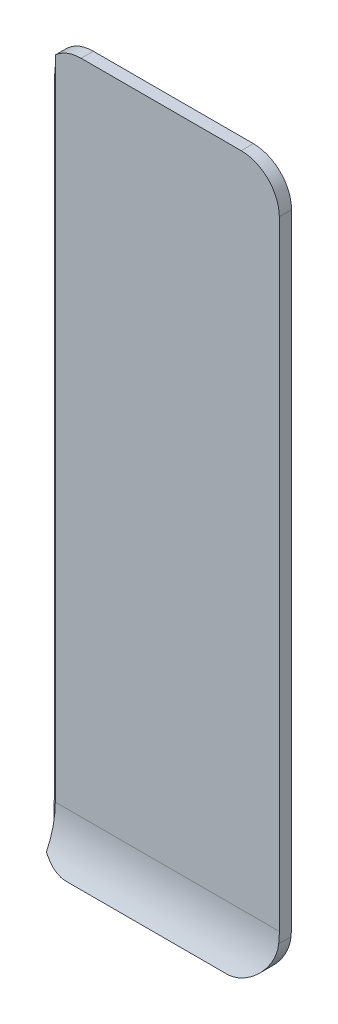
ISO-10303-21;
HEADER;
FILE_DESCRIPTION(('STEP AP214'),'2;1');
FILE_NAME('part.step','',(''),(''),'','','');
FILE_SCHEMA(('AUTOMOTIVE_DESIGN { 1 0 10303 214 1 1 1 1 }'));
ENDSEC;
DATA;
#1=APPLICATION_CONTEXT('core data for automotive mechanical design processes');
#2=APPLICATION_PROTOCOL_DEFINITION('international standard','automotive_design',2000,#1);
#3=PRODUCT_CONTEXT('',#1,'mechanical');
#4=PRODUCT('Part','Part','',(#3));
#5=PRODUCT_RELATED_PRODUCT_CATEGORY('part','',(#4));
#6=PRODUCT_DEFINITION_FORMATION('','',#4);
#7=PRODUCT_DEFINITION_CONTEXT('part definition',#1,'design');
#8=PRODUCT_DEFINITION('design','',#6,#7);
#9=PRODUCT_DEFINITION_SHAPE('','',#8);
#10=(LENGTH_UNIT() NAMED_UNIT(*) SI_UNIT(.MILLI.,.METRE.));
#11=(NAMED_UNIT(*) PLANE_ANGLE_UNIT() SI_UNIT($,.RADIAN.));
#12=(NAMED_UNIT(*) SI_UNIT($,.STERADIAN.) SOLID_ANGLE_UNIT());
#13=UNCERTAINTY_MEASURE_WITH_UNIT(LENGTH_MEASURE(1.E-05),#10,'distance_accuracy_value','');
#14=(GEOMETRIC_REPRESENTATION_CONTEXT(3) GLOBAL_UNCERTAINTY_ASSIGNED_CONTEXT((#13)) GLOBAL_UNIT_ASSIGNED_CONTEXT((#10,
#11,#12)) REPRESENTATION_CONTEXT('',''));
#15=CARTESIAN_POINT('',(0.,0.,0.));
#16=DIRECTION('',(0.,0.,1.));
#17=DIRECTION('',(1.,0.,0.));
#18=AXIS2_PLACEMENT_3D('',#15,#16,#17);
#19=CARTESIAN_POINT('',(619.,0.,32.));
#20=DIRECTION('',(0.,0.,-1.));
#21=DIRECTION('',(0.,1.,0.));
#22=AXIS2_PLACEMENT_3D('',#19,#20,#21);
#23=PLANE('',#22);
#24=DIRECTION('',(0.,1.,0.));
#25=VECTOR('',#24,1.);
#26=CARTESIAN_POINT('',(32.5,1848.,31.9999999999998));
#27=LINE('',#26,#25);
#28=CARTESIAN_POINT('',(32.5,127.446930131722,32.));
#29=VERTEX_POINT('',#28);
#30=CARTESIAN_POINT('',(32.5,1821.78177281687,31.9999999999998));
#31=VERTEX_POINT('',#30);
#32=EDGE_CURVE('E290',#29,#31,#27,.T.);
#33=ORIENTED_EDGE('',*,*,#32,.F.);
#34=DIRECTION('',(-1.,0.,0.));
#35=VECTOR('',#34,1.);
#36=CARTESIAN_POINT('',(619.,127.446930131722,32.));
#37=LINE('',#36,#35);
#38=CARTESIAN_POINT('',(619.,127.446930131722,32.));
#39=VERTEX_POINT('',#38);
#40=EDGE_CURVE('E471',#39,#29,#37,.T.);
#41=ORIENTED_EDGE('',*,*,#40,.F.);
#42=DIRECTION('',(0.,-1.,0.));
#43=VECTOR('',#42,1.);
#44=CARTESIAN_POINT('',(619.,0.,32.));
#45=LINE('',#44,#43);
#46=CARTESIAN_POINT('',(619.,1748.,31.9999999999999));
#47=VERTEX_POINT('',#46);
#48=EDGE_CURVE('E457',#47,#39,#45,.T.);
#49=ORIENTED_EDGE('',*,*,#48,.F.);
#50=CARTESIAN_POINT('',(519.,1748.,31.9999999999999));
#51=DIRECTION('',(0.,0.,-1.));
#52=DIRECTION('',(0.,1.,0.));
#53=AXIS2_PLACEMENT_3D('',#50,#51,#52);
#54=CIRCLE('',#53,100.);
#55=CARTESIAN_POINT('',(519.,1848.,31.9999999999999));
#56=VERTEX_POINT('',#55);
#57=EDGE_CURVE('E412',#56,#47,#54,.T.);
#58=ORIENTED_EDGE('',*,*,#57,.F.);
#59=DIRECTION('',(-1.,0.,0.));
#60=VECTOR('',#59,1.);
#61=CARTESIAN_POINT('',(619.,1848.,31.9999999999999));
#62=LINE('',#61,#60);
#63=CARTESIAN_POINT('',(100.,1848.,31.9999999999999));
#64=VERTEX_POINT('',#63);
#65=EDGE_CURVE('E451',#56,#64,#62,.T.);
#66=ORIENTED_EDGE('',*,*,#65,.T.);
#67=CARTESIAN_POINT('',(100.,1748.,31.9999999999999));
#68=DIRECTION('',(0.,0.,-1.));
#69=DIRECTION('',(0.,1.,0.));
#70=AXIS2_PLACEMENT_3D('',#67,#68,#69);
#71=CIRCLE('',#70,100.);
#72=EDGE_CURVE('E506',#31,#64,#71,.T.);
#73=ORIENTED_EDGE('',*,*,#72,.F.);
#74=EDGE_LOOP('',(#33,#41,#49,#58,#66,#73));
#75=FACE_BOUND('',#74,.T.);
#76=ADVANCED_FACE('F174',(#75),#23,.F.);
#77=CARTESIAN_POINT('',(619.,127.446930131722,264.72));
#78=DIRECTION('',(-1.,0.,0.));
#79=DIRECTION('',(0.,0.,1.));
#80=AXIS2_PLACEMENT_3D('',#77,#78,#79);
#81=CYLINDRICAL_SURFACE('',#80,232.72);
#82=CARTESIAN_POINT('',(32.5,127.446930131722,264.72));
#83=DIRECTION('',(-1.,0.,0.));
#84=DIRECTION('',(0.,0.,1.));
#85=AXIS2_PLACEMENT_3D('',#82,#83,#84);
#86=CIRCLE('',#85,232.72);
#87=CARTESIAN_POINT('',(32.5,26.2182271831315,55.1696525907292));
#88=VERTEX_POINT('',#87);
#89=EDGE_CURVE('E12',#88,#29,#86,.F.);
#90=ORIENTED_EDGE('',*,*,#89,.F.);
#91=CARTESIAN_POINT('',(100.000000000001,0.,69.9999999999999));
#92=CARTESIAN_POINT('',(98.7198197089697,-3.4698594050321E-05,70.0000509763334));
#93=CARTESIAN_POINT('',(97.439652230179,0.0245815621368389,69.9839119463368));
#94=CARTESIAN_POINT('',(94.8820639765618,0.122862892112704,69.9196234798617));
#95=CARTESIAN_POINT('',(93.6046430770499,0.196525685541535,69.8714755286344));
#96=CARTESIAN_POINT('',(91.0560089387093,0.392580922295405,69.7435818762787));
#97=CARTESIAN_POINT('',(89.7847920962634,0.514940488855972,69.663857493593));
#98=CARTESIAN_POINT('',(87.2502546411074,0.807907020868423,69.4735226187817));
#99=CARTESIAN_POINT('',(85.9869340771845,0.97851428411858,69.3629119360171));
#100=CARTESIAN_POINT('',(83.4789277123208,1.36606212977329,69.1125719878279));
#101=CARTESIAN_POINT('',(82.234173996887,1.58269057330033,68.97303903554));
#102=CARTESIAN_POINT('',(79.7570212815522,2.0621955038391,68.6655488047547));
#103=CARTESIAN_POINT('',(78.5246236025374,2.32507688082448,68.4975885209217));
#104=CARTESIAN_POINT('',(76.074412554528,2.89619614383816,68.1345796051548));
#105=CARTESIAN_POINT('',(74.8565993379382,3.20443450339168,67.9395306904178));
#106=CARTESIAN_POINT('',(72.4373945492545,3.86532701733694,67.5238079673618));
#107=CARTESIAN_POINT('',(71.2360046526703,4.21798566655604,67.3031315660097));
#108=CARTESIAN_POINT('',(68.8546814121097,4.96567825225909,66.838382459443));
#109=CARTESIAN_POINT('',(67.6746996687698,5.36059748728867,66.5943732654884));
#110=CARTESIAN_POINT('',(65.3344950636642,6.19250811085542,66.0841483638062));
#111=CARTESIAN_POINT('',(64.1742740752037,6.6295034623384,65.8179305646736));
#112=CARTESIAN_POINT('',(60.72575628049,8.00188554873549,64.9886228409477));
#113=CARTESIAN_POINT('',(58.4689648828789,8.9988698221595,64.3947522095117));
#114=CARTESIAN_POINT('',(54.0470655543328,11.1496495249836,63.1385191593972));
#115=CARTESIAN_POINT('',(51.8821089644468,12.3036915444161,62.4760494351777));
#116=CARTESIAN_POINT('',(47.6552250226393,14.7591732371291,61.0976781329845));
#117=CARTESIAN_POINT('',(45.5933030784267,16.0606206352031,60.3817737554335));
#118=CARTESIAN_POINT('',(41.3921917066704,18.9309764748862,58.8419306549945));
#119=CARTESIAN_POINT('',(39.2637185222361,20.5135081855694,58.0141422464184));
#120=CARTESIAN_POINT('',(35.1459557573445,23.8360177211081,56.3289089931109));
#121=CARTESIAN_POINT('',(33.1566728357727,25.5760030694524,55.4714627324711));
#122=CARTESIAN_POINT('',(29.3240399896439,29.2053836026813,53.7431316644415));
#123=CARTESIAN_POINT('',(27.4807543952578,31.094843925197,52.8722411328966));
#124=CARTESIAN_POINT('',(23.948448661222,35.0144607467335,51.1329399230475));
#125=CARTESIAN_POINT('',(22.2594353776961,37.0446234917642,50.2645293566172));
#126=CARTESIAN_POINT('',(19.7568534961458,40.3074423155143,48.9263459475948));
#127=CARTESIAN_POINT('',(18.8870011920031,41.4948617847292,48.4504437592022));
#128=CARTESIAN_POINT('',(17.1992060334361,43.9090277300756,47.5065191842756));
#129=CARTESIAN_POINT('',(16.3812589823096,45.1357710146512,47.0384961629402));
#130=CARTESIAN_POINT('',(14.798618902337,47.6272653527657,46.1126207069017));
#131=CARTESIAN_POINT('',(14.033937437254,48.8920245746398,45.65477049528));
#132=CARTESIAN_POINT('',(12.5596700212016,51.4574710323985,44.7517080590417));
#133=CARTESIAN_POINT('',(11.850078076529,52.7581543388315,44.3064944629228));
#134=CARTESIAN_POINT('',(10.4882856258948,55.3922784831771,43.4313886017683));
#135=CARTESIAN_POINT('',(9.83602228664765,56.7256813556928,43.0014798778126));
#136=CARTESIAN_POINT('',(8.58972147210493,59.4245156005648,42.1586651972311));
#137=CARTESIAN_POINT('',(7.9956778023838,60.7899435463341,41.7457574344627));
#138=CARTESIAN_POINT('',(6.86746081426198,63.5506713309373,40.9390034030173));
#139=CARTESIAN_POINT('',(6.33328144065563,64.9459681315357,40.5451552087805));
#140=CARTESIAN_POINT('',(5.32639155335511,67.7642018545995,39.7784462593437));
#141=CARTESIAN_POINT('',(4.85367832604773,69.1871375536703,39.4055845780417));
#142=CARTESIAN_POINT('',(4.05212363157295,71.7952122791721,38.7488797266629));
#143=CARTESIAN_POINT('',(3.71278767954092,72.9761828736718,38.4612383896953));
#144=CARTESIAN_POINT('',(3.07704789291639,75.3533965562662,37.9021150587025));
#145=CARTESIAN_POINT('',(2.78064299612713,76.5496392657022,37.6306326649719));
#146=CARTESIAN_POINT('',(2.23161209205389,78.955649426998,37.1047319493603));
#147=CARTESIAN_POINT('',(1.97897953688364,80.1654148271325,36.8503110787496));
#148=CARTESIAN_POINT('',(1.51821644357809,82.5968621963487,36.3593030746753));
#149=CARTESIAN_POINT('',(1.31008163413474,83.8185430098964,36.1227142309405));
#150=CARTESIAN_POINT('',(0.938446067432608,86.2756847006434,35.6674021994801));
#151=CARTESIAN_POINT('',(0.775074747537756,87.5111750080425,35.4487320769209));
#152=CARTESIAN_POINT('',(0.494378633905274,89.9906063805052,35.0306381001949));
#153=CARTESIAN_POINT('',(0.37705338117638,91.234547361206,34.8312140541965));
#154=CARTESIAN_POINT('',(0.188940541106296,93.7295881735627,34.4520439555517));
#155=CARTESIAN_POINT('',(0.118176662724469,94.980691325642,34.2723079667895));
#156=CARTESIAN_POINT('',(0.0236958887934082,97.4874501473326,33.9330194058127));
#157=CARTESIAN_POINT('',(-1.91688966658773E-05,98.7431059928657,33.7734676222778));
#158=CARTESIAN_POINT('',(0.,100.000000000001,33.6242094144846));
#159=B_SPLINE_CURVE_WITH_KNOTS('',3,(#91,#92,#93,#94,#95,#96,#97,#98,#99,#100,#101,#102,#103,
#104,#105,#106,#107,#108,#109,#110,#111,#112,#113,#114,#115,#116,#117,#118,#119,#120,#121,#122,
#123,#124,#125,#126,#127,#128,#129,#130,#131,#132,#133,#134,#135,#136,#137,#138,#139,#140,#141,
#142,#143,#144,#145,#146,#147,#148,#149,#150,#151,#152,#153,#154,#155,#156,#157,#158),
.UNSPECIFIED.,.F.,.F.,(4,2,2,2,2,2,2,2,2,2,2,2,2,2,2,2,2,2,2,2,2,2,2,2,2,2,2,2,2,2,2,2,2,4),(0.,
3.84018226888647,7.6801863612674,11.5176023288582,15.35504198257,19.1672408451736,
22.9798429852402,26.7924849315566,30.6055129842071,34.4084425109883,38.2117305683219,
45.8162649687765,53.4328797281392,61.0498938218015,69.3769927848348,77.7044898456937,
86.0356360355546,94.3671522957593,99.0068529929909,103.646178076669,108.286507221856,
112.926330792724,117.561003903649,122.195183360514,126.828893651503,131.462399303507,
135.247441126802,139.032389284889,142.816770764422,146.600788820514,150.395635899403,
154.19044514996,157.98718521755,161.784073593556),.UNSPECIFIED.);
#160=CARTESIAN_POINT('',(100.000000000001,0.,70.));
#161=VERTEX_POINT('',#160);
#162=EDGE_CURVE('E357',#161,#88,#159,.T.);
#163=ORIENTED_EDGE('',*,*,#162,.F.);
#164=DIRECTION('',(1.,0.,0.));
#165=VECTOR('',#164,1.);
#166=CARTESIAN_POINT('',(100.000000000001,0.,70.));
#167=LINE('',#166,#165);
#168=CARTESIAN_POINT('',(519.,0.,70.));
#169=VERTEX_POINT('',#168);
#170=EDGE_CURVE('E443',#161,#169,#167,.T.);
#171=ORIENTED_EDGE('',*,*,#170,.T.);
#172=CARTESIAN_POINT('',(619.,100.,33.6242094144847));
#173=CARTESIAN_POINT('',(619.000028069173,98.6148268452014,33.7886931118485));
#174=CARTESIAN_POINT('',(618.971220707669,97.231163329206,33.9656887510996));
#175=CARTESIAN_POINT('',(618.8565129221,94.4696275187115,34.3441457009941));
#176=CARTESIAN_POINT('',(618.770615354344,93.0917549379536,34.5456057872323));
#177=CARTESIAN_POINT('',(618.542364225347,90.3451483742039,34.97233896559));
#178=CARTESIAN_POINT('',(618.400040055311,88.9764100102376,35.1975996158567));
#179=CARTESIAN_POINT('',(618.059690027828,86.2499036405943,35.6712765475865));
#180=CARTESIAN_POINT('',(617.861663638572,84.8921357397834,35.9196930501113));
#181=CARTESIAN_POINT('',(617.411831801021,82.1963459511547,36.4375910943036));
#182=CARTESIAN_POINT('',(617.160281654681,80.8582614818452,36.7069689139042));
#183=CARTESIAN_POINT('',(616.603796862741,78.1975623480794,37.2668255641178));
#184=CARTESIAN_POINT('',(616.298856842909,76.8749492552858,37.5573065172513));
#185=CARTESIAN_POINT('',(615.636657976302,74.2474884892093,38.1582336300966));
#186=CARTESIAN_POINT('',(615.279399263899,72.9426407703086,38.4686797385303));
#187=CARTESIAN_POINT('',(614.513642598499,70.3526055206684,39.1083510335595));
#188=CARTESIAN_POINT('',(614.105139688317,69.0674199054849,39.4375780352705));
#189=CARTESIAN_POINT('',(613.238912314544,66.5211682285832,40.1128292315282));
#190=CARTESIAN_POINT('',(612.78128484972,65.2600602225843,40.4588196105764));
#191=CARTESIAN_POINT('',(611.817346002917,62.7611167526597,41.1668038499529));
#192=CARTESIAN_POINT('',(611.311030157414,61.5232834349087,41.5287991758934));
#193=CARTESIAN_POINT('',(609.720945416411,57.8474752721019,42.6365511942702));
#194=CARTESIAN_POINT('',(608.565801890937,55.4464962410211,43.4042595602058));
#195=CARTESIAN_POINT('',(606.073872990014,50.7535822601559,44.9863635200146));
#196=CARTESIAN_POINT('',(604.736883539379,48.4617737845558,45.800810964212));
#197=CARTESIAN_POINT('',(601.891299964008,43.999694849553,47.4624911832328));
#198=CARTESIAN_POINT('',(600.38269748795,41.8294303126025,48.3097255522641));
#199=CARTESIAN_POINT('',(597.089142062223,37.4694186587178,50.0840914720831));
#200=CARTESIAN_POINT('',(595.292153225262,35.2893218601619,51.0126117012639));
#201=CARTESIAN_POINT('',(591.521081077024,31.0894923326465,52.8730780102913));
#202=CARTESIAN_POINT('',(589.546988900552,29.069767640922,53.805024259391));
#203=CARTESIAN_POINT('',(585.429589459293,25.1996007563113,55.653777509807));
#204=CARTESIAN_POINT('',(583.286151467102,23.3492917710001,56.5705721414392));
#205=CARTESIAN_POINT('',(578.840181573988,19.8302585237088,58.3679869027091));
#206=CARTESIAN_POINT('',(576.537649488562,18.161534472321,59.248606990393));
#207=CARTESIAN_POINT('',(572.920975807188,15.7697188405483,60.5444131747391));
#208=CARTESIAN_POINT('',(571.660591684961,14.975954033178,60.980832993313));
#209=CARTESIAN_POINT('',(569.10089624166,13.4429380346039,61.8346689979427));
#210=CARTESIAN_POINT('',(567.801589186962,12.7036808992912,62.2520872542303));
#211=CARTESIAN_POINT('',(565.16534970905,11.2813182712557,63.0647984981835));
#212=CARTESIAN_POINT('',(563.828406868271,10.5982285349236,63.4600852675457));
#213=CARTESIAN_POINT('',(561.119308319156,9.2904313896761,64.2250772834076));
#214=CARTESIAN_POINT('',(559.747157263428,8.66571631693909,64.5947858863235));
#215=CARTESIAN_POINT('',(556.973196093844,7.47807361012916,65.3044808747895));
#216=CARTESIAN_POINT('',(555.571470671496,6.91499225893107,65.6445407531157));
#217=CARTESIAN_POINT('',(552.737632730134,5.85084958898624,66.2927343528613));
#218=CARTESIAN_POINT('',(551.305524505789,5.34977957234291,66.6008725507217));
#219=CARTESIAN_POINT('',(548.41403259162,4.41169574852989,67.1820695666731));
#220=CARTESIAN_POINT('',(546.954658937313,3.97465887687485,67.4551410112698));
#221=CARTESIAN_POINT('',(544.011498212164,3.16636104484741,67.9633827940326));
#222=CARTESIAN_POINT('',(542.527714176558,2.79509197332543,68.1985578056461));
#223=CARTESIAN_POINT('',(539.241131701148,2.05270791220762,68.6712346342868));
#224=CARTESIAN_POINT('',(537.433689556171,1.69637020546398,68.8998591730929));
#225=CARTESIAN_POINT('',(533.795661684785,1.08342236918336,69.2948335406402));
#226=CARTESIAN_POINT('',(531.965083263968,0.826781533123199,69.4612025434352));
#227=CARTESIAN_POINT('',(529.205102891259,0.517757594852006,69.6620649390539));
#228=CARTESIAN_POINT('',(528.281535040055,0.427337211756786,69.7209490778037));
#229=CARTESIAN_POINT('',(526.431305831884,0.272183737157343,69.8221011259015));
#230=CARTESIAN_POINT('',(525.504644497502,0.207450458528697,69.8643691562938));
#231=CARTESIAN_POINT('',(523.648846269931,0.103792612519486,69.9320955147734));
#232=CARTESIAN_POINT('',(522.719708435101,0.0648799143396051,69.9575461122031));
#233=CARTESIAN_POINT('',(520.860382748077,0.0129787845894659,69.9915054092897));
#234=CARTESIAN_POINT('',(519.930194876607,-9.16304065959842E-06,70.0000137926844));
#235=CARTESIAN_POINT('',(519.,0.,69.9999999999998));
#236=B_SPLINE_CURVE_WITH_KNOTS('',3,(#172,#173,#174,#175,#176,#177,#178,#179,#180,#181,#182,
#183,#184,#185,#186,#187,#188,#189,#190,#191,#192,#193,#194,#195,#196,#197,#198,#199,#200,#201,
#202,#203,#204,#205,#206,#207,#208,#209,#210,#211,#212,#213,#214,#215,#216,#217,#218,#219,#220,
#221,#222,#223,#224,#225,#226,#227,#228,#229,#230,#231,#232,#233,#234,#235),.UNSPECIFIED.,.F.,
.F.,(4,2,2,2,2,2,2,2,2,2,2,2,2,2,2,2,2,2,2,2,2,2,2,2,2,2,2,2,2,2,2,4),(0.,4.18432548507172,
8.36844163778998,12.5503812463004,16.7323607825808,20.8948228778441,25.05770420828,
29.2205748472601,33.3838484987202,37.5390477336482,41.694628261657,50.0035206682099,
58.3218158096169,66.640515923246,75.5525250395435,84.4649805100347,93.3843845132072,
102.303798860504,106.958877372936,111.6134474919,116.269318913395,120.924578219168,
125.567949027794,130.210667803307,134.851710156904,139.492179731164,145.057481888114,
150.621068576691,153.410197726269,156.199306557333,158.989696598995,161.780138728684),.UNSPECIFIED.);
#237=CARTESIAN_POINT('',(619.,100.,33.6242094144847));
#238=VERTEX_POINT('',#237);
#239=EDGE_CURVE('E349',#238,#169,#236,.T.);
#240=ORIENTED_EDGE('',*,*,#239,.F.);
#241=CARTESIAN_POINT('',(619.,127.446930131722,264.72));
#242=DIRECTION('',(-1.,0.,0.));
#243=DIRECTION('',(0.,0.,1.));
#244=AXIS2_PLACEMENT_3D('',#241,#242,#243);
#245=CIRCLE('',#244,232.72);
#246=EDGE_CURVE('E467',#39,#238,#245,.T.);
#247=ORIENTED_EDGE('',*,*,#246,.F.);
#248=ORIENTED_EDGE('',*,*,#40,.T.);
#249=EDGE_LOOP('',(#90,#163,#171,#240,#247,#248));
#250=FACE_BOUND('',#249,.T.);
#251=ADVANCED_FACE('F328',(#250),#81,.F.);
#252=CARTESIAN_POINT('',(100.,100.,70.));
#253=DIRECTION('',(0.,0.,-1.));
#254=DIRECTION('',(-1.,0.,0.));
#255=AXIS2_PLACEMENT_3D('',#252,#253,#254);
#256=CYLINDRICAL_SURFACE('',#255,100.);
#257=DIRECTION('',(0.,0.,-1.));
#258=VECTOR('',#257,1.);
#259=CARTESIAN_POINT('',(32.5,26.2182271831315,70.));
#260=LINE('',#259,#258);
#261=CARTESIAN_POINT('',(32.5,26.2182271831315,21.2020579518913));
#262=VERTEX_POINT('',#261);
#263=EDGE_CURVE('E190',#262,#88,#260,.F.);
#264=ORIENTED_EDGE('',*,*,#263,.F.);
#265=CARTESIAN_POINT('',(32.5,26.2182271831315,21.2020579518913));
#266=CARTESIAN_POINT('',(31.4441358656986,27.18419602599,20.8005032260007));
#267=CARTESIAN_POINT('',(30.4095321637802,28.1723484894706,20.3964838998934));
#268=CARTESIAN_POINT('',(28.3841842608256,30.1915491960904,19.5857268995023));
#269=CARTESIAN_POINT('',(27.3934399097633,31.2225972924766,19.1789892345225));
#270=CARTESIAN_POINT('',(25.4569718857776,33.3263093498009,18.3649320749907));
#271=CARTESIAN_POINT('',(24.5112561588606,34.3989805956263,17.9576124907162));
#272=CARTESIAN_POINT('',(22.666443375434,36.5841814320721,17.1446399374011));
#273=CARTESIAN_POINT('',(21.7673463881928,37.6967110819119,16.7389869708376));
#274=CARTESIAN_POINT('',(19.1347040518729,41.1013056790594,15.5243134445428));
#275=CARTESIAN_POINT('',(17.4735239475986,43.451996199642,14.7208461659425));
#276=CARTESIAN_POINT('',(14.3558816300483,48.2952847954872,13.1454830004974));
#277=CARTESIAN_POINT('',(12.8994024793954,50.787871105994,12.3735845053384));
#278=CARTESIAN_POINT('',(10.875551168294,54.6245571308502,11.250229427963));
#279=CARTESIAN_POINT('',(10.2270934885182,55.921298973964,10.8811225775983));
#280=CARTESIAN_POINT('',(8.9858609774918,58.5448237187626,10.1564736898989));
#281=CARTESIAN_POINT('',(8.39308073626832,59.871603686173,9.8009303366465));
#282=CARTESIAN_POINT('',(7.2644816883681,62.5534924530916,9.10505499666509));
#283=CARTESIAN_POINT('',(6.7286774921421,63.908608412747,8.76472692451757));
#284=CARTESIAN_POINT('',(5.71565548910165,66.6444926701922,8.10105483341023));
#285=CARTESIAN_POINT('',(5.23843123572221,68.025258126035,7.77770894785121));
#286=CARTESIAN_POINT('',(4.34529427288967,70.8057756377539,7.15050894653765));
#287=CARTESIAN_POINT('',(3.92919134547852,72.2054533185404,6.84659609487885));
#288=CARTESIAN_POINT('',(3.15782493767318,75.025420163174,6.25859500949616));
#289=CARTESIAN_POINT('',(2.80255456303034,76.4457069715396,5.97450453143664));
#290=CARTESIAN_POINT('',(2.15413705404113,79.3037805406417,5.42751717721052));
#291=CARTESIAN_POINT('',(1.86096391439357,80.7415597080524,5.16461145790812));
#292=CARTESIAN_POINT('',(1.33768132849109,83.6322313179982,4.66104052486067));
#293=CARTESIAN_POINT('',(1.10756292101442,85.0851215824775,4.42037215401044));
#294=CARTESIAN_POINT('',(0.758571350732282,87.6551190008965,4.01688290124046));
#295=CARTESIAN_POINT('',(0.626255810846091,88.7696572951606,3.84918613064133));
#296=CARTESIAN_POINT('',(0.399108319094969,91.0042634880851,3.52764882839623));
#297=CARTESIAN_POINT('',(0.304266811918665,92.1243299033107,3.37380477225268));
#298=CARTESIAN_POINT('',(0.152359116938101,94.3685658745172,3.08028561090914));
#299=CARTESIAN_POINT('',(0.0952828561738235,95.4927342558948,2.94060673591505));
#300=CARTESIAN_POINT('',(0.0190926496329532,97.7443432269705,2.67557294075223));
#301=CARTESIAN_POINT('',(-1.12325118692454E-05,98.8717846048316,2.55022182609272));
#302=CARTESIAN_POINT('',(0.,100.000000000001,2.43217255399681));
#303=B_SPLINE_CURVE_WITH_KNOTS('',3,(#265,#266,#267,#268,#269,#270,#271,#272,#273,#274,#275,
#276,#277,#278,#279,#280,#281,#282,#283,#284,#285,#286,#287,#288,#289,#290,#291,#292,#293,#294,
#295,#296,#297,#298,#299,#300,#301,#302),.UNSPECIFIED.,.F.,.F.,(4,2,2,2,2,2,2,2,2,2,2,2,2,2,2,2,
2,2,4),(0.,4.4586504437248,8.91728563492921,13.3767047280608,17.8361304470237,26.7904252760036,
35.7439787715266,40.2310721093001,44.7177290006276,49.205533651497,53.6928439879455,
58.165879046351,62.6384068326643,67.1090578783212,71.5790732334074,74.9828715176189,
78.3858013238051,81.787823115037,85.1907464071318),.UNSPECIFIED.);
#304=CARTESIAN_POINT('',(0.,100.000000000001,2.4321725539968));
#305=VERTEX_POINT('',#304);
#306=EDGE_CURVE('E294',#262,#305,#303,.T.);
#307=ORIENTED_EDGE('',*,*,#306,.T.);
#308=DIRECTION('',(0.,0.,-1.));
#309=VECTOR('',#308,1.);
#310=CARTESIAN_POINT('',(0.,100.000000000001,70.));
#311=LINE('',#310,#309);
#312=CARTESIAN_POINT('',(0.,100.000000000001,1.42673304023816));
#313=VERTEX_POINT('',#312);
#314=EDGE_CURVE('E446',#305,#313,#311,.T.);
#315=ORIENTED_EDGE('',*,*,#314,.T.);
#316=CARTESIAN_POINT('',(0.,100.000000000001,1.4267330402381));
#317=CARTESIAN_POINT('',(-2.61733614519786E-05,98.6090658352118,1.57170266653152));
#318=CARTESIAN_POINT('',(0.0290193063493295,97.2193049481032,1.72774660343505));
#319=CARTESIAN_POINT('',(0.144772062194768,94.4448481185563,2.06149697351221));
#320=CARTESIAN_POINT('',(0.231477034124557,93.0601519759425,2.23920254080593));
#321=CARTESIAN_POINT('',(0.462018673777076,90.2990142901069,2.6157222290139));
#322=CARTESIAN_POINT('',(0.605831211051162,88.9225695093634,2.81452740845328));
#323=CARTESIAN_POINT('',(0.949938708195479,86.1798894944613,3.23265081709496));
#324=CARTESIAN_POINT('',(1.1502340801018,84.8136543348555,3.451969195931));
#325=CARTESIAN_POINT('',(1.6056537271976,82.0991844994704,3.90944141689456));
#326=CARTESIAN_POINT('',(1.86056055950092,80.750900328973,4.14751825949453));
#327=CARTESIAN_POINT('',(2.42483046026472,78.0691065708112,4.64238013686886));
#328=CARTESIAN_POINT('',(2.73419892585647,76.7355984613844,4.89916702432339));
#329=CARTESIAN_POINT('',(3.40642147143633,74.085738073611,5.43041754850044));
#330=CARTESIAN_POINT('',(3.76927427655688,72.7693853871567,5.70488076379733));
#331=CARTESIAN_POINT('',(4.54749054125825,70.1557747084463,6.27041147078673));
#332=CARTESIAN_POINT('',(4.9628590434173,68.8585185632201,6.5614805555067));
#333=CARTESIAN_POINT('',(5.84435410055971,66.2871106843349,7.15856174229595));
#334=CARTESIAN_POINT('',(6.31040476593871,65.0129276503379,7.46455113435126));
#335=CARTESIAN_POINT('',(7.292694052929,62.4874500740877,8.090623047046));
#336=CARTESIAN_POINT('',(7.80893729227102,61.2361576503835,8.41070686289144));
#337=CARTESIAN_POINT('',(8.89038877554648,58.7584491809751,9.0635667221979));
#338=CARTESIAN_POINT('',(9.45559148658583,57.5320303435971,9.39634132910377));
#339=CARTESIAN_POINT('',(10.6338549395927,55.1055480274984,10.0732047597591));
#340=CARTESIAN_POINT('',(11.246919954073,53.9054869139264,10.4172945919915));
#341=CARTESIAN_POINT('',(13.1572679246877,50.345227545985,11.4649408887327));
#342=CARTESIAN_POINT('',(14.5249553970063,48.0266653678738,12.1834202349758));
#343=CARTESIAN_POINT('',(17.4380141450824,43.5134047265377,13.6473534419583));
#344=CARTESIAN_POINT('',(18.9833923726407,41.3187111144378,14.3928083572813));
#345=CARTESIAN_POINT('',(22.3336494060536,36.9449307624702,15.9394926758054));
#346=CARTESIAN_POINT('',(24.1481828941488,34.7735075346263,16.7415175021665));
#347=CARTESIAN_POINT('',(27.9548346630749,30.5918662194891,18.3446958211292));
#348=CARTESIAN_POINT('',(29.9469602966826,28.5816548133363,19.1458492762623));
#349=CARTESIAN_POINT('',(34.0992079928796,24.7331187802375,20.7304823219355));
#350=CARTESIAN_POINT('',(36.2594094192223,22.8948762686799,21.5139533349734));
#351=CARTESIAN_POINT('',(40.7365855729214,19.4028258657199,23.0450435840938));
#352=CARTESIAN_POINT('',(43.0535586990074,17.7490160909734,23.7926631862303));
#353=CARTESIAN_POINT('',(46.6700068269602,15.3946848698928,24.8830776778981));
#354=CARTESIAN_POINT('',(47.9167122522702,14.6214959048085,25.2460289995452));
#355=CARTESIAN_POINT('',(50.4464876081571,13.1287991388564,25.9549989589583));
#356=CARTESIAN_POINT('',(51.7295536558253,12.4092856356336,26.301019394074));
#357=CARTESIAN_POINT('',(54.3304849093389,11.0254753000557,26.9736742904581));
#358=CARTESIAN_POINT('',(55.6483583457805,10.3611916842734,27.3003041062127));
#359=CARTESIAN_POINT('',(58.3163946583011,9.0898225129533,27.9315350232183));
#360=CARTESIAN_POINT('',(59.6665536090266,8.48273004786154,28.2361387845129));
#361=CARTESIAN_POINT('',(62.3945627655218,7.32842548416509,28.8203582230395));
#362=CARTESIAN_POINT('',(63.7723586260211,6.7811073437237,29.1000179847293));
#363=CARTESIAN_POINT('',(66.5553263667407,5.74684534902598,29.6325564870152));
#364=CARTESIAN_POINT('',(67.9604947790191,5.25989390349141,29.8854385943905));
#365=CARTESIAN_POINT('',(70.7952385312421,4.34803746468405,30.362141724786));
#366=CARTESIAN_POINT('',(72.2248066071837,3.92311435284338,30.5859712319879));
#367=CARTESIAN_POINT('',(75.1055734180862,3.13671064024979,31.0025517353405));
#368=CARTESIAN_POINT('',(76.5567698780617,2.77522341736973,31.195305975294));
#369=CARTESIAN_POINT('',(79.8100714915924,2.04213618560702,31.588005534302));
#370=CARTESIAN_POINT('',(81.6169178870826,1.68693575843543,31.7796152722664));
#371=CARTESIAN_POINT('',(85.2515810970268,1.07639513461538,32.1102695310668));
#372=CARTESIAN_POINT('',(87.0793918325787,0.821026707940952,32.2493289114756));
#373=CARTESIAN_POINT('',(90.7520134231981,0.411386875980119,32.4729244189923));
#374=CARTESIAN_POINT('',(92.5968419899613,0.257236700358154,32.5573951630797));
#375=CARTESIAN_POINT('',(95.369738410206,0.102958966810055,32.6420080918979));
#376=CARTESIAN_POINT('',(96.2952121278368,0.0643576216457979,32.6631969006325));
#377=CARTESIAN_POINT('',(98.1471024345609,0.0128769598666768,32.6914651753081));
#378=CARTESIAN_POINT('',(99.0735190363495,-2.00570400173947E-06,32.6985444486904));
#379=CARTESIAN_POINT('',(100.000000000001,0.,32.6985389236588));
#380=B_SPLINE_CURVE_WITH_KNOTS('',3,(#316,#317,#318,#319,#320,#321,#322,#323,#324,#325,#326,
#327,#328,#329,#330,#331,#332,#333,#334,#335,#336,#337,#338,#339,#340,#341,#342,#343,#344,#345,
#346,#347,#348,#349,#350,#351,#352,#353,#354,#355,#356,#357,#358,#359,#360,#361,#362,#363,#364,
#365,#366,#367,#368,#369,#370,#371,#372,#373,#374,#375,#376,#377,#378,#379),.UNSPECIFIED.,.F.,
.F.,(4,2,2,2,2,2,2,2,2,2,2,2,2,2,2,2,2,2,2,2,2,2,2,2,2,2,2,2,2,2,2,4),(0.,4.19503172022143,
8.38989580747705,12.582989263738,16.7761133089477,20.9528422585723,25.1299853540089,
29.3070288980002,33.4844738284247,37.6557475619808,41.8274054176626,45.9985924491517,
50.170152255684,58.519024053684,66.8682225960578,75.6819959972139,84.4961344811491,
93.3144604727466,102.132696407321,106.665170537548,111.197162460612,115.730235791456,
120.262760754394,124.78710956186,129.310888841612,133.833344063171,138.355326900527,
143.905797659899,149.454697745854,155.010231716318,157.789392064359,160.568590340517),.UNSPECIFIED.);
#381=CARTESIAN_POINT('',(100.000000000001,0.,32.6985389236588));
#382=VERTEX_POINT('',#381);
#383=EDGE_CURVE('E341',#313,#382,#380,.T.);
#384=ORIENTED_EDGE('',*,*,#383,.T.);
#385=DIRECTION('',(0.,0.,-1.));
#386=VECTOR('',#385,1.);
#387=CARTESIAN_POINT('',(100.000000000001,0.,70.));
#388=LINE('',#387,#386);
#389=EDGE_CURVE('E184',#161,#382,#388,.T.);
#390=ORIENTED_EDGE('',*,*,#389,.F.);
#391=ORIENTED_EDGE('',*,*,#162,.T.);
#392=EDGE_LOOP('',(#264,#307,#315,#384,#390,#391));
#393=FACE_BOUND('',#392,.T.);
#394=ADVANCED_FACE('F176',(#393),#256,.T.);
#395=CARTESIAN_POINT('',(100.000000000001,0.,70.));
#396=DIRECTION('',(0.,1.,0.));
#397=DIRECTION('',(0.,0.,1.));
#398=AXIS2_PLACEMENT_3D('',#395,#396,#397);
#399=PLANE('',#398);
#400=ORIENTED_EDGE('',*,*,#389,.T.);
#401=DIRECTION('',(-1.,0.,0.));
#402=VECTOR('',#401,1.);
#403=CARTESIAN_POINT('',(619.,0.,32.6985389236588));
#404=LINE('',#403,#402);
#405=CARTESIAN_POINT('',(519.,0.,32.6985389236588));
#406=VERTEX_POINT('',#405);
#407=EDGE_CURVE('E442',#406,#382,#404,.T.);
#408=ORIENTED_EDGE('',*,*,#407,.F.);
#409=DIRECTION('',(0.,0.,-1.));
#410=VECTOR('',#409,1.);
#411=CARTESIAN_POINT('',(519.,0.,70.));
#412=LINE('',#411,#410);
#413=EDGE_CURVE('E434',#169,#406,#412,.T.);
#414=ORIENTED_EDGE('',*,*,#413,.F.);
#415=ORIENTED_EDGE('',*,*,#170,.F.);
#416=EDGE_LOOP('',(#400,#408,#414,#415));
#417=FACE_BOUND('',#416,.T.);
#418=ADVANCED_FACE('F368',(#417),#399,.F.);
#419=CARTESIAN_POINT('',(519.,100.,70.));
#420=DIRECTION('',(0.,0.,-1.));
#421=DIRECTION('',(-1.,0.,0.));
#422=AXIS2_PLACEMENT_3D('',#419,#420,#421);
#423=CYLINDRICAL_SURFACE('',#422,100.);
#424=ORIENTED_EDGE('',*,*,#413,.T.);
#425=CARTESIAN_POINT('',(519.,0.,32.6985389236588));
#426=CARTESIAN_POINT('',(520.309908376861,-3.10420277061312E-05,32.698579730086));
#427=CARTESIAN_POINT('',(521.619807154216,0.0257366885771971,32.6844028198184));
#428=CARTESIAN_POINT('',(524.236934982897,0.128643887065852,32.6279088350687));
#429=CARTESIAN_POINT('',(525.54416412225,0.205781632761689,32.5855927039585));
#430=CARTESIAN_POINT('',(528.152739080183,0.41115180987073,32.4731435833718));
#431=CARTESIAN_POINT('',(529.454087509885,0.539358716388517,32.4030244901837));
#432=CARTESIAN_POINT('',(532.049030454088,0.846433720378712,32.2355414039735));
#433=CARTESIAN_POINT('',(533.342624937783,1.02530201899941,32.1381773027767));
#434=CARTESIAN_POINT('',(535.912835220642,1.43205383378148,31.9175461650667));
#435=CARTESIAN_POINT('',(537.18950451466,1.6596749180598,31.7944178935238));
#436=CARTESIAN_POINT('',(539.730570020104,2.1638030457206,31.522876446358));
#437=CARTESIAN_POINT('',(540.994964966337,2.4403150733248,31.3744606928411));
#438=CARTESIAN_POINT('',(543.509139287192,3.0413868476081,31.0534528779826));
#439=CARTESIAN_POINT('',(544.758919000897,3.36594547717609,30.880861378746));
#440=CARTESIAN_POINT('',(547.241968668642,4.06223900735755,30.5127168730586));
#441=CARTESIAN_POINT('',(548.475236978921,4.43397856693614,30.3171615991516));
#442=CARTESIAN_POINT('',(550.920974162237,5.2228963586067,29.9048350983466));
#443=CARTESIAN_POINT('',(552.133477179329,5.63998958550863,29.6881036362363));
#444=CARTESIAN_POINT('',(554.538355971171,6.51917531259432,29.2345414597212));
#445=CARTESIAN_POINT('',(555.730729848858,6.98127202663942,28.9977088634319));
#446=CARTESIAN_POINT('',(558.09349601432,7.94931728562401,28.505492195722));
#447=CARTESIAN_POINT('',(559.263890741731,8.45526092822673,28.2501101987456));
#448=CARTESIAN_POINT('',(561.581362952186,9.5099513511636,27.72233086564));
#449=CARTESIAN_POINT('',(562.728438335228,10.058701965104,27.4499320059907));
#450=CARTESIAN_POINT('',(566.135061131945,11.7687950854395,26.6089695796565));
#451=CARTESIAN_POINT('',(568.35773260754,12.9930460128867,26.0171184470276));
#452=CARTESIAN_POINT('',(572.693631274314,15.5997884357963,24.7846472724402));
#453=CARTESIAN_POINT('',(574.806853724513,16.9822867777146,24.1440251208419));
#454=CARTESIAN_POINT('',(579.062065524613,20.0010709724005,22.7799239843515));
#455=CARTESIAN_POINT('',(581.19536563029,21.6484231321574,22.0537939493262));
#456=CARTESIAN_POINT('',(585.317104829791,25.1048968505997,20.5759462043716));
#457=CARTESIAN_POINT('',(587.305538149011,26.9140248515135,19.8242274761896));
#458=CARTESIAN_POINT('',(591.129138571713,30.6847758002332,18.3099888680432));
#459=CARTESIAN_POINT('',(592.96424762392,32.6464559690998,17.5474650237256));
#460=CARTESIAN_POINT('',(596.471683064169,36.7122071710616,16.0262180840268));
#461=CARTESIAN_POINT('',(598.144004627453,38.8162824213849,15.2674951019287));
#462=CARTESIAN_POINT('',(600.58897613785,42.1609258032957,14.1116930429683));
#463=CARTESIAN_POINT('',(601.422631403023,43.3551979732988,13.7082663805821));
#464=CARTESIAN_POINT('',(603.038015567714,45.7806824470141,12.9086974342616));
#465=CARTESIAN_POINT('',(603.81974885453,47.0118916168332,12.5125545369153));
#466=CARTESIAN_POINT('',(605.329977366825,49.5097472900499,11.7295108842323));
#467=CARTESIAN_POINT('',(606.05846177378,50.7764009227795,11.3426120176853));
#468=CARTESIAN_POINT('',(607.460472428367,53.342924608469,10.5801436680631));
#469=CARTESIAN_POINT('',(608.134004487706,54.6427911297214,10.2045729895844));
#470=CARTESIAN_POINT('',(609.424114319163,57.2726927943524,9.46695260173602));
#471=CARTESIAN_POINT('',(610.040743161734,58.6026995247176,9.10489094541358));
#472=CARTESIAN_POINT('',(611.216192238134,61.2917724021966,8.39577793342776));
#473=CARTESIAN_POINT('',(611.775018458194,62.6508355225072,8.04872502557885));
#474=CARTESIAN_POINT('',(612.83341763799,65.3957658238009,7.37134685361128));
#475=CARTESIAN_POINT('',(613.332997768856,66.7816297371575,7.04101956780728));
#476=CARTESIAN_POINT('',(614.271526537893,69.5777828803983,6.39869136131824));
#477=CARTESIAN_POINT('',(614.710478203154,70.9880708868636,6.08668952611763));
#478=CARTESIAN_POINT('',(615.755526261491,74.6287943919954,5.31285341999429));
#479=CARTESIAN_POINT('',(616.317125256296,76.8752082371863,4.8652294822094));
#480=CARTESIAN_POINT('',(617.2843782214,81.4108631793749,4.02347743050582));
#481=CARTESIAN_POINT('',(617.690064924649,83.7000951809793,3.62933809903349));
#482=CARTESIAN_POINT('',(618.178982871793,87.1590764078144,3.0810595013926));
#483=CARTESIAN_POINT('',(618.32209049548,88.3172498525287,2.90532453892979));
#484=CARTESIAN_POINT('',(618.567843680216,90.6400772280825,2.56868751129781));
#485=CARTESIAN_POINT('',(618.670489548111,91.8047311097094,2.40778533365026));
#486=CARTESIAN_POINT('',(618.83497775076,94.1393620135682,2.10113041690741));
#487=CARTESIAN_POINT('',(618.89680405243,95.3093409459139,1.95538364945832));
#488=CARTESIAN_POINT('',(618.979321925174,97.6526007835348,1.67937572736468));
#489=CARTESIAN_POINT('',(619.000012430763,98.8258817735506,1.54911497391541));
#490=CARTESIAN_POINT('',(619.,100.,1.4267330402382));
#491=B_SPLINE_CURVE_WITH_KNOTS('',3,(#425,#426,#427,#428,#429,#430,#431,#432,#433,#434,#435,
#436,#437,#438,#439,#440,#441,#442,#443,#444,#445,#446,#447,#448,#449,#450,#451,#452,#453,#454,
#455,#456,#457,#458,#459,#460,#461,#462,#463,#464,#465,#466,#467,#468,#469,#470,#471,#472,#473,
#474,#475,#476,#477,#478,#479,#480,#481,#482,#483,#484,#485,#486,#487,#488,#489,#490),
.UNSPECIFIED.,.F.,.F.,(4,2,2,2,2,2,2,2,2,2,2,2,2,2,2,2,2,2,2,2,2,2,2,2,2,2,2,2,2,2,2,2,4),(0.,
3.92937990330969,7.85862808016534,11.7859148373348,15.7132171878001,19.619887933436,
23.5269571772511,27.4339355937244,31.3413001123553,35.2414634376627,39.1419923030295,
43.0420856282494,46.9425286307353,54.7509019535702,62.5596132276065,70.9250098752665,
79.2907397977543,87.6596229137667,96.0287539944312,100.561498054756,105.093858619294,
109.627137474505,114.159936271294,118.68862650377,123.21684725939,127.744519359819,
132.271965318422,139.340953595899,146.408456965362,149.94820510916,153.487926408512,
157.02903721151,160.57023973388),.UNSPECIFIED.);
#492=CARTESIAN_POINT('',(619.,100.,1.42673304023822));
#493=VERTEX_POINT('',#492);
#494=EDGE_CURVE('E333',#406,#493,#491,.T.);
#495=ORIENTED_EDGE('',*,*,#494,.T.);
#496=DIRECTION('',(0.,0.,-1.));
#497=VECTOR('',#496,1.);
#498=CARTESIAN_POINT('',(619.,100.,70.));
#499=LINE('',#498,#497);
#500=EDGE_CURVE('E425',#238,#493,#499,.T.);
#501=ORIENTED_EDGE('',*,*,#500,.F.);
#502=ORIENTED_EDGE('',*,*,#239,.T.);
#503=EDGE_LOOP('',(#424,#495,#501,#502));
#504=FACE_BOUND('',#503,.T.);
#505=ADVANCED_FACE('F363',(#504),#423,.T.);
#506=CARTESIAN_POINT('',(619.,100.,70.));
#507=DIRECTION('',(-1.,0.,0.));
#508=DIRECTION('',(0.,0.,1.));
#509=AXIS2_PLACEMENT_3D('',#506,#507,#508);
#510=PLANE('',#509);
#511=ORIENTED_EDGE('',*,*,#500,.T.);
#512=CARTESIAN_POINT('',(619.,127.446930131722,264.72));
#513=DIRECTION('',(1.,0.,0.));
#514=DIRECTION('',(0.,0.,-1.));
#515=AXIS2_PLACEMENT_3D('',#512,#513,#514);
#516=CIRCLE('',#515,264.72);
#517=CARTESIAN_POINT('',(619.,127.446930131722,0.));
#518=VERTEX_POINT('',#517);
#519=EDGE_CURVE('E452',#493,#518,#516,.T.);
#520=ORIENTED_EDGE('',*,*,#519,.T.);
#521=DIRECTION('',(0.,1.,0.));
#522=VECTOR('',#521,1.);
#523=CARTESIAN_POINT('',(619.,100.,0.));
#524=LINE('',#523,#522);
#525=CARTESIAN_POINT('',(619.,1748.,0.));
#526=VERTEX_POINT('',#525);
#527=EDGE_CURVE('E489',#518,#526,#524,.T.);
#528=ORIENTED_EDGE('',*,*,#527,.T.);
#529=DIRECTION('',(0.,0.,-1.));
#530=VECTOR('',#529,1.);
#531=CARTESIAN_POINT('',(619.,1748.,70.));
#532=LINE('',#531,#530);
#533=EDGE_CURVE('E420',#47,#526,#532,.T.);
#534=ORIENTED_EDGE('',*,*,#533,.F.);
#535=ORIENTED_EDGE('',*,*,#48,.T.);
#536=ORIENTED_EDGE('',*,*,#246,.T.);
#537=EDGE_LOOP('',(#511,#520,#528,#534,#535,#536));
#538=FACE_BOUND('',#537,.T.);
#539=ADVANCED_FACE('F367',(#538),#510,.F.);
#540=CARTESIAN_POINT('',(519.,1748.,70.));
#541=DIRECTION('',(0.,0.,-1.));
#542=DIRECTION('',(-1.,0.,0.));
#543=AXIS2_PLACEMENT_3D('',#540,#541,#542);
#544=CYLINDRICAL_SURFACE('',#543,100.);
#545=DIRECTION('',(0.,0.,-1.));
#546=VECTOR('',#545,1.);
#547=CARTESIAN_POINT('',(519.,1848.,70.));
#548=LINE('',#547,#546);
#549=CARTESIAN_POINT('',(519.,1848.,0.));
#550=VERTEX_POINT('',#549);
#551=EDGE_CURVE('E411',#56,#550,#548,.T.);
#552=ORIENTED_EDGE('',*,*,#551,.F.);
#553=ORIENTED_EDGE('',*,*,#57,.T.);
#554=ORIENTED_EDGE('',*,*,#533,.T.);
#555=CARTESIAN_POINT('',(519.,1748.,0.));
#556=DIRECTION('',(0.,0.,1.));
#557=DIRECTION('',(-1.,0.,0.));
#558=AXIS2_PLACEMENT_3D('',#555,#556,#557);
#559=CIRCLE('',#558,100.);
#560=EDGE_CURVE('E415',#526,#550,#559,.T.);
#561=ORIENTED_EDGE('',*,*,#560,.T.);
#562=EDGE_LOOP('',(#552,#553,#554,#561));
#563=FACE_BOUND('',#562,.T.);
#564=ADVANCED_FACE('F400',(#563),#544,.T.);
#565=CARTESIAN_POINT('',(100.,1848.,70.));
#566=DIRECTION('',(0.,-1.,0.));
#567=DIRECTION('',(0.,0.,-1.));
#568=AXIS2_PLACEMENT_3D('',#565,#566,#567);
#569=PLANE('',#568);
#570=DIRECTION('',(0.,0.,-1.));
#571=VECTOR('',#570,1.);
#572=CARTESIAN_POINT('',(100.,1848.,70.));
#573=LINE('',#572,#571);
#574=CARTESIAN_POINT('',(100.,1848.,0.));
#575=VERTEX_POINT('',#574);
#576=EDGE_CURVE('E421',#64,#575,#573,.T.);
#577=ORIENTED_EDGE('',*,*,#576,.F.);
#578=ORIENTED_EDGE('',*,*,#65,.F.);
#579=ORIENTED_EDGE('',*,*,#551,.T.);
#580=DIRECTION('',(-1.,0.,0.));
#581=VECTOR('',#580,1.);
#582=CARTESIAN_POINT('',(100.,1848.,0.));
#583=LINE('',#582,#581);
#584=EDGE_CURVE('E494',#550,#575,#583,.T.);
#585=ORIENTED_EDGE('',*,*,#584,.T.);
#586=EDGE_LOOP('',(#577,#578,#579,#585));
#587=FACE_BOUND('',#586,.T.);
#588=ADVANCED_FACE('F397',(#587),#569,.F.);
#589=CARTESIAN_POINT('',(100.,1748.,70.));
#590=DIRECTION('',(0.,0.,-1.));
#591=DIRECTION('',(-1.,0.,0.));
#592=AXIS2_PLACEMENT_3D('',#589,#590,#591);
#593=CYLINDRICAL_SURFACE('',#592,100.);
#594=DIRECTION('',(0.,0.,-1.));
#595=VECTOR('',#594,1.);
#596=CARTESIAN_POINT('',(0.,1748.,70.));
#597=LINE('',#596,#595);
#598=CARTESIAN_POINT('',(0.,1748.,1.00000000000001));
#599=VERTEX_POINT('',#598);
#600=CARTESIAN_POINT('',(0.,1748.,0.));
#601=VERTEX_POINT('',#600);
#602=EDGE_CURVE('E427',#599,#601,#597,.T.);
#603=ORIENTED_EDGE('',*,*,#602,.F.);
#604=CARTESIAN_POINT('',(100.,1748.,1.00000000000001));
#605=DIRECTION('',(0.,0.,-1.));
#606=DIRECTION('',(0.,1.,0.));
#607=AXIS2_PLACEMENT_3D('',#604,#605,#606);
#608=CIRCLE('',#607,100.);
#609=CARTESIAN_POINT('',(32.5,1821.78177281687,1.));
#610=VERTEX_POINT('',#609);
#611=EDGE_CURVE('E315',#599,#610,#608,.T.);
#612=ORIENTED_EDGE('',*,*,#611,.T.);
#613=DIRECTION('',(0.,0.,-1.));
#614=VECTOR('',#613,1.);
#615=CARTESIAN_POINT('',(32.5,1821.78177281687,70.));
#616=LINE('',#615,#614);
#617=EDGE_CURVE('E276',#31,#610,#616,.T.);
#618=ORIENTED_EDGE('',*,*,#617,.F.);
#619=ORIENTED_EDGE('',*,*,#72,.T.);
#620=ORIENTED_EDGE('',*,*,#576,.T.);
#621=CARTESIAN_POINT('',(100.,1748.,0.));
#622=DIRECTION('',(0.,0.,1.));
#623=DIRECTION('',(-1.,0.,0.));
#624=AXIS2_PLACEMENT_3D('',#621,#622,#623);
#625=CIRCLE('',#624,100.);
#626=EDGE_CURVE('E485',#575,#601,#625,.T.);
#627=ORIENTED_EDGE('',*,*,#626,.T.);
#628=EDGE_LOOP('',(#603,#612,#618,#619,#620,#627));
#629=FACE_BOUND('',#628,.T.);
#630=ADVANCED_FACE('F393',(#629),#593,.T.);
#631=CARTESIAN_POINT('',(0.,100.000000000001,70.));
#632=DIRECTION('',(1.,0.,0.));
#633=DIRECTION('',(0.,0.,-1.));
#634=AXIS2_PLACEMENT_3D('',#631,#632,#633);
#635=PLANE('',#634);
#636=CARTESIAN_POINT('',(0.,127.446930131722,264.72));
#637=DIRECTION('',(-1.,0.,0.));
#638=DIRECTION('',(0.,0.,1.));
#639=AXIS2_PLACEMENT_3D('',#636,#637,#638);
#640=CIRCLE('',#639,263.72);
#641=CARTESIAN_POINT('',(0.,127.446930131722,1.00000000000017));
#642=VERTEX_POINT('',#641);
#643=EDGE_CURVE('E280',#642,#305,#640,.T.);
#644=ORIENTED_EDGE('',*,*,#643,.F.);
#645=DIRECTION('',(0.,-1.,0.));
#646=VECTOR('',#645,1.);
#647=CARTESIAN_POINT('',(0.,1848.,1.));
#648=LINE('',#647,#646);
#649=EDGE_CURVE('E286',#599,#642,#648,.T.);
#650=ORIENTED_EDGE('',*,*,#649,.F.);
#651=ORIENTED_EDGE('',*,*,#602,.T.);
#652=DIRECTION('',(0.,-1.,0.));
#653=VECTOR('',#652,1.);
#654=CARTESIAN_POINT('',(0.,100.000000000001,0.));
#655=LINE('',#654,#653);
#656=CARTESIAN_POINT('',(0.,127.446930131722,0.));
#657=VERTEX_POINT('',#656);
#658=EDGE_CURVE('E449',#601,#657,#655,.T.);
#659=ORIENTED_EDGE('',*,*,#658,.T.);
#660=CARTESIAN_POINT('',(0.,127.446930131722,264.72));
#661=DIRECTION('',(1.,0.,0.));
#662=DIRECTION('',(0.,0.,-1.));
#663=AXIS2_PLACEMENT_3D('',#660,#661,#662);
#664=CIRCLE('',#663,264.72);
#665=EDGE_CURVE('E198',#313,#657,#664,.T.);
#666=ORIENTED_EDGE('',*,*,#665,.F.);
#667=ORIENTED_EDGE('',*,*,#314,.F.);
#668=EDGE_LOOP('',(#644,#650,#651,#659,#666,#667));
#669=FACE_BOUND('',#668,.T.);
#670=ADVANCED_FACE('F389',(#669),#635,.F.);
#671=CARTESIAN_POINT('',(100.,100.,0.));
#672=DIRECTION('',(0.,0.,-1.));
#673=DIRECTION('',(-1.,0.,0.));
#674=AXIS2_PLACEMENT_3D('',#671,#672,#673);
#675=PLANE('',#674);
#676=DIRECTION('',(-1.,0.,0.));
#677=VECTOR('',#676,1.);
#678=CARTESIAN_POINT('',(619.,127.446930131722,0.));
#679=LINE('',#678,#677);
#680=EDGE_CURVE('E459',#518,#657,#679,.T.);
#681=ORIENTED_EDGE('',*,*,#680,.T.);
#682=ORIENTED_EDGE('',*,*,#658,.F.);
#683=ORIENTED_EDGE('',*,*,#626,.F.);
#684=ORIENTED_EDGE('',*,*,#584,.F.);
#685=ORIENTED_EDGE('',*,*,#560,.F.);
#686=ORIENTED_EDGE('',*,*,#527,.F.);
#687=EDGE_LOOP('',(#681,#682,#683,#684,#685,#686));
#688=FACE_BOUND('',#687,.T.);
#689=ADVANCED_FACE('F327',(#688),#675,.T.);
#690=CARTESIAN_POINT('',(619.,127.446930131722,264.72));
#691=DIRECTION('',(-1.,0.,0.));
#692=DIRECTION('',(0.,0.,1.));
#693=AXIS2_PLACEMENT_3D('',#690,#691,#692);
#694=CYLINDRICAL_SURFACE('',#693,264.72);
#695=ORIENTED_EDGE('',*,*,#665,.T.);
#696=ORIENTED_EDGE('',*,*,#680,.F.);
#697=ORIENTED_EDGE('',*,*,#519,.F.);
#698=ORIENTED_EDGE('',*,*,#494,.F.);
#699=ORIENTED_EDGE('',*,*,#407,.T.);
#700=ORIENTED_EDGE('',*,*,#383,.F.);
#701=EDGE_LOOP('',(#695,#696,#697,#698,#699,#700));
#702=FACE_BOUND('',#701,.T.);
#703=ADVANCED_FACE('F323',(#702),#694,.T.);
#704=CARTESIAN_POINT('',(32.5,1848.,1.));
#705=DIRECTION('',(0.,0.,-1.));
#706=DIRECTION('',(0.,1.,0.));
#707=AXIS2_PLACEMENT_3D('',#704,#705,#706);
#708=PLANE('',#707);
#709=ORIENTED_EDGE('',*,*,#649,.T.);
#710=DIRECTION('',(-1.,0.,0.));
#711=VECTOR('',#710,1.);
#712=CARTESIAN_POINT('',(32.5,127.446930131722,1.00000000000017));
#713=LINE('',#712,#711);
#714=CARTESIAN_POINT('',(32.5,127.446930131722,1.00000000000017));
#715=VERTEX_POINT('',#714);
#716=EDGE_CURVE('E283',#715,#642,#713,.T.);
#717=ORIENTED_EDGE('',*,*,#716,.F.);
#718=DIRECTION('',(0.,-1.,0.));
#719=VECTOR('',#718,1.);
#720=CARTESIAN_POINT('',(32.5,1848.,1.));
#721=LINE('',#720,#719);
#722=EDGE_CURVE('E270',#610,#715,#721,.T.);
#723=ORIENTED_EDGE('',*,*,#722,.F.);
#724=ORIENTED_EDGE('',*,*,#611,.F.);
#725=EDGE_LOOP('',(#709,#717,#723,#724));
#726=FACE_BOUND('',#725,.T.);
#727=ADVANCED_FACE('F284',(#726),#708,.F.);
#728=CARTESIAN_POINT('',(32.5,127.446930131722,264.72));
#729=DIRECTION('',(-1.,0.,0.));
#730=DIRECTION('',(0.,0.,1.));
#731=AXIS2_PLACEMENT_3D('',#728,#729,#730);
#732=CYLINDRICAL_SURFACE('',#731,263.72);
#733=CARTESIAN_POINT('',(32.5,127.446930131722,264.72));
#734=DIRECTION('',(-1.,0.,0.));
#735=DIRECTION('',(0.,0.,1.));
#736=AXIS2_PLACEMENT_3D('',#733,#734,#735);
#737=CIRCLE('',#736,263.72);
#738=EDGE_CURVE('E274',#715,#262,#737,.T.);
#739=ORIENTED_EDGE('',*,*,#738,.F.);
#740=ORIENTED_EDGE('',*,*,#716,.T.);
#741=ORIENTED_EDGE('',*,*,#643,.T.);
#742=ORIENTED_EDGE('',*,*,#306,.F.);
#743=EDGE_LOOP('',(#739,#740,#741,#742));
#744=FACE_BOUND('',#743,.T.);
#745=ADVANCED_FACE('F292',(#744),#732,.F.);
#746=CARTESIAN_POINT('',(32.5,127.446930131722,264.72));
#747=DIRECTION('',(-1.,0.,0.));
#748=DIRECTION('',(0.,0.,1.));
#749=AXIS2_PLACEMENT_3D('',#746,#747,#748);
#750=PLANE('',#749);
#751=ORIENTED_EDGE('',*,*,#263,.T.);
#752=ORIENTED_EDGE('',*,*,#89,.T.);
#753=ORIENTED_EDGE('',*,*,#32,.T.);
#754=ORIENTED_EDGE('',*,*,#617,.T.);
#755=ORIENTED_EDGE('',*,*,#722,.T.);
#756=ORIENTED_EDGE('',*,*,#738,.T.);
#757=EDGE_LOOP('',(#751,#752,#753,#754,#755,#756));
#758=FACE_BOUND('',#757,.T.);
#759=ADVANCED_FACE('F272',(#758),#750,.T.);
#760=CLOSED_SHELL('',(#76,#251,#394,#418,#505,#539,#564,#588,#630,#670,#689,#703,#727,#745,#759));
#761=MANIFOLD_SOLID_BREP('B2',#760);
#762=ADVANCED_BREP_SHAPE_REPRESENTATION('',(#18,#761),#14);
#763=SHAPE_DEFINITION_REPRESENTATION(#9,#762);
ENDSEC;
END-ISO-10303-21;
